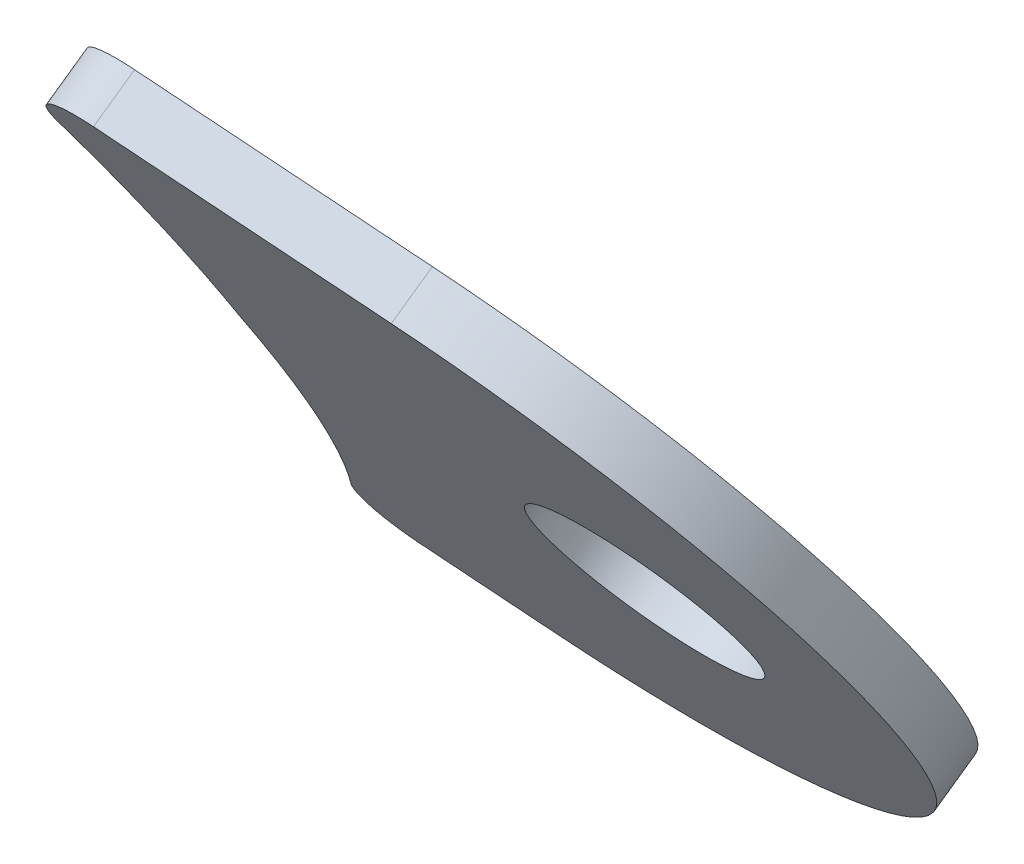
ISO-10303-21;
HEADER;
FILE_DESCRIPTION(('STEP AP214'),'2;1');
FILE_NAME('part.step','',(''),(''),'','','');
FILE_SCHEMA(('AUTOMOTIVE_DESIGN { 1 0 10303 214 1 1 1 1 }'));
ENDSEC;
DATA;
#1=APPLICATION_CONTEXT('core data for automotive mechanical design processes');
#2=APPLICATION_PROTOCOL_DEFINITION('international standard','automotive_design',2000,#1);
#3=PRODUCT_CONTEXT('',#1,'mechanical');
#4=PRODUCT('Part','Part','',(#3));
#5=PRODUCT_RELATED_PRODUCT_CATEGORY('part','',(#4));
#6=PRODUCT_DEFINITION_FORMATION('','',#4);
#7=PRODUCT_DEFINITION_CONTEXT('part definition',#1,'design');
#8=PRODUCT_DEFINITION('design','',#6,#7);
#9=PRODUCT_DEFINITION_SHAPE('','',#8);
#10=(LENGTH_UNIT() NAMED_UNIT(*) SI_UNIT(.MILLI.,.METRE.));
#11=(NAMED_UNIT(*) PLANE_ANGLE_UNIT() SI_UNIT($,.RADIAN.));
#12=(NAMED_UNIT(*) SI_UNIT($,.STERADIAN.) SOLID_ANGLE_UNIT());
#13=UNCERTAINTY_MEASURE_WITH_UNIT(LENGTH_MEASURE(1.E-05),#10,'distance_accuracy_value','');
#14=(GEOMETRIC_REPRESENTATION_CONTEXT(3) GLOBAL_UNCERTAINTY_ASSIGNED_CONTEXT((#13)) GLOBAL_UNIT_ASSIGNED_CONTEXT((#10,
#11,#12)) REPRESENTATION_CONTEXT('',''));
#15=CARTESIAN_POINT('',(0.,0.,0.));
#16=DIRECTION('',(0.,0.,1.));
#17=DIRECTION('',(1.,0.,0.));
#18=AXIS2_PLACEMENT_3D('',#15,#16,#17);
#19=CARTESIAN_POINT('',(371.040543840284,300.287470839087,-261.642448336467));
#20=DIRECTION('',(0.,0.57357643635105,-0.819152044288989));
#21=DIRECTION('',(0.,0.819152044288989,0.57357643635105));
#22=AXIS2_PLACEMENT_3D('',#19,#20,#21);
#23=PLANE('',#22);
#24=DIRECTION('',(-0.94219390202809,0.274471742735837,0.192187183289192));
#25=VECTOR('',#24,1.);
#26=CARTESIAN_POINT('',(366.785178603698,290.485610064858,-268.505785139065));
#27=LINE('',#26,#25);
#28=CARTESIAN_POINT('',(366.785178603698,290.485610064858,-268.505785139065));
#29=VERTEX_POINT('',#28);
#30=CARTESIAN_POINT('',(363.185469858074,291.534245946099,-267.771522390183));
#31=VERTEX_POINT('',#30);
#32=EDGE_CURVE('E149',#29,#31,#27,.T.);
#33=ORIENTED_EDGE('',*,*,#32,.T.);
#34=CARTESIAN_POINT('',(363.717390512647,292.759478542878,-266.913605289858));
#35=DIRECTION('',(0.,0.57357643635105,-0.819152044288989));
#36=DIRECTION('',(0.,0.819152044288989,0.57357643635105));
#37=AXIS2_PLACEMENT_3D('',#34,#35,#36);
#38=CIRCLE('',#37,1.5875);
#39=CARTESIAN_POINT('',(362.293575400517,293.334583238913,-266.510912646434));
#40=VERTEX_POINT('',#39);
#41=EDGE_CURVE('E208',#31,#40,#38,.T.);
#42=ORIENTED_EDGE('',*,*,#41,.T.);
#43=CARTESIAN_POINT('',(352.67946044919,303.158891685046,-259.631857814754));
#44=DIRECTION('',(0.,0.57357643635105,-0.819152044288989));
#45=DIRECTION('',(0.111787479362518,0.814017711231802,0.569981337640728));
#46=AXIS2_PLACEMENT_3D('',#43,#44,#45);
#47=ELLIPSE('',#46,21.0993504691637,12.7);
#48=CARTESIAN_POINT('',(365.299858584944,301.995940718526,-260.44616484808));
#49=VERTEX_POINT('',#48);
#50=EDGE_CURVE('E129',#40,#49,#47,.F.);
#51=ORIENTED_EDGE('',*,*,#50,.T.);
#52=CARTESIAN_POINT('',(365.401849986694,302.854607331279,-259.844920013018));
#53=VERTEX_POINT('',#52);
#54=EDGE_CURVE('E121',#49,#53,#47,.F.);
#55=ORIENTED_EDGE('',*,*,#54,.T.);
#56=CARTESIAN_POINT('',(352.91490042542,304.873326178752,-258.431397858495));
#57=DIRECTION('',(0.,-0.57357643635105,0.819152044288989));
#58=DIRECTION('',(0.111787479362519,0.814017711231802,0.569981337640728));
#59=AXIS2_PLACEMENT_3D('',#56,#57,#58);
#60=ELLIPSE('',#59,21.0993504691637,12.7);
#61=CARTESIAN_POINT('',(365.376596906032,310.940102346574,-254.183395453155));
#62=VERTEX_POINT('',#61);
#63=EDGE_CURVE('E107',#62,#53,#60,.F.);
#64=ORIENTED_EDGE('',*,*,#63,.F.);
#65=CARTESIAN_POINT('',(366.944866523468,311.141897683687,-254.042096836933));
#66=DIRECTION('',(0.,0.57357643635105,-0.819152044288989));
#67=DIRECTION('',(0.,0.819152044288989,0.57357643635105));
#68=AXIS2_PLACEMENT_3D('',#65,#66,#67);
#69=CIRCLE('',#68,1.5875);
#70=CARTESIAN_POINT('',(367.476787178041,312.367130280465,-253.184179736608));
#71=VERTEX_POINT('',#70);
#72=EDGE_CURVE('E206',#62,#71,#69,.T.);
#73=ORIENTED_EDGE('',*,*,#72,.T.);
#74=DIRECTION('',(0.942193902028088,-0.274471742735843,-0.192187183289195));
#75=VECTOR('',#74,1.);
#76=CARTESIAN_POINT('',(352.936883083732,316.60276883362,-250.218353692558));
#77=LINE('',#76,#75);
#78=CARTESIAN_POINT('',(375.295909076869,310.089331613316,-254.77911153387));
#79=VERTEX_POINT('',#78);
#80=EDGE_CURVE('E144',#71,#79,#77,.T.);
#81=ORIENTED_EDGE('',*,*,#80,.T.);
#82=CARTESIAN_POINT('',(371.040543840284,300.287470839087,-261.642448336467));
#83=DIRECTION('',(0.,0.57357643635105,-0.819152044288989));
#84=DIRECTION('',(0.,0.819152044288989,0.57357643635105));
#85=AXIS2_PLACEMENT_3D('',#82,#83,#84);
#86=CIRCLE('',#85,12.6999999999999);
#87=EDGE_CURVE('E146',#79,#29,#86,.T.);
#88=ORIENTED_EDGE('',*,*,#87,.T.);
#89=EDGE_LOOP('',(#33,#42,#51,#55,#64,#73,#81,#88));
#90=FACE_BOUND('',#89,.T.);
#91=CARTESIAN_POINT('',(375.527742298692,298.980299164308,-262.557739796882));
#92=DIRECTION('',(0.,0.57357643635105,-0.819152044288989));
#93=DIRECTION('',(0.,0.819152044288989,0.57357643635105));
#94=AXIS2_PLACEMENT_3D('',#91,#92,#93);
#95=CIRCLE('',#94,3.30199999999999);
#96=CARTESIAN_POINT('',(375.527742298692,301.68513921455,-260.663790404051));
#97=VERTEX_POINT('',#96);
#98=EDGE_CURVE('E137',#97,#97,#95,.T.);
#99=ORIENTED_EDGE('',*,*,#98,.F.);
#100=EDGE_LOOP('',(#99));
#101=FACE_BOUND('',#100,.T.);
#102=ADVANCED_FACE('F43',(#90,#101),#23,.T.);
#103=CARTESIAN_POINT('',(371.040543840284,299.37691824638,-260.342044466158));
#104=DIRECTION('',(0.,0.57357643635105,-0.819152044288989));
#105=DIRECTION('',(0.,0.819152044288989,0.57357643635105));
#106=AXIS2_PLACEMENT_3D('',#103,#104,#105);
#107=PLANE('',#106);
#108=CARTESIAN_POINT('',(352.67946044919,302.248339092339,-258.331453944445));
#109=DIRECTION('',(0.,0.57357643635105,-0.819152044288989));
#110=DIRECTION('',(0.111787479362519,0.814017711231802,0.569981337640728));
#111=AXIS2_PLACEMENT_3D('',#108,#109,#110);
#112=ELLIPSE('',#111,21.0993504691637,12.7);
#113=CARTESIAN_POINT('',(365.401849986694,301.944054738573,-258.544516142712));
#114=VERTEX_POINT('',#113);
#115=CARTESIAN_POINT('',(362.293575400517,292.424030646206,-265.210508776125));
#116=VERTEX_POINT('',#115);
#117=EDGE_CURVE('E114',#114,#116,#112,.T.);
#118=ORIENTED_EDGE('',*,*,#117,.T.);
#119=CARTESIAN_POINT('',(363.717390512647,291.84892595017,-265.613201419549));
#120=DIRECTION('',(0.,0.57357643635105,-0.819152044288989));
#121=DIRECTION('',(0.,0.819152044288989,0.57357643635105));
#122=AXIS2_PLACEMENT_3D('',#119,#120,#121);
#123=CIRCLE('',#122,1.5875);
#124=CARTESIAN_POINT('',(363.185469858074,290.623693353392,-266.471118519874));
#125=VERTEX_POINT('',#124);
#126=EDGE_CURVE('E214',#116,#125,#123,.F.);
#127=ORIENTED_EDGE('',*,*,#126,.T.);
#128=DIRECTION('',(-0.94219390202809,0.274471742735837,0.192187183289192));
#129=VECTOR('',#128,1.);
#130=CARTESIAN_POINT('',(366.785178603698,289.575057472151,-267.205381268756));
#131=LINE('',#130,#129);
#132=CARTESIAN_POINT('',(366.785178603698,289.575057472151,-267.205381268756));
#133=VERTEX_POINT('',#132);
#134=EDGE_CURVE('E147',#133,#125,#131,.T.);
#135=ORIENTED_EDGE('',*,*,#134,.F.);
#136=CARTESIAN_POINT('',(371.040543840284,299.37691824638,-260.342044466158));
#137=DIRECTION('',(0.,0.57357643635105,-0.819152044288989));
#138=DIRECTION('',(0.,0.819152044288989,0.57357643635105));
#139=AXIS2_PLACEMENT_3D('',#136,#137,#138);
#140=CIRCLE('',#139,12.6999999999999);
#141=CARTESIAN_POINT('',(375.295909076869,309.178779020609,-253.478707663561));
#142=VERTEX_POINT('',#141);
#143=EDGE_CURVE('E155',#142,#133,#140,.T.);
#144=ORIENTED_EDGE('',*,*,#143,.F.);
#145=DIRECTION('',(0.942193902028088,-0.274471742735843,-0.192187183289195));
#146=VECTOR('',#145,1.);
#147=CARTESIAN_POINT('',(352.936883083732,315.692216240912,-248.917949822249));
#148=LINE('',#147,#146);
#149=CARTESIAN_POINT('',(367.476787178041,311.456577687758,-251.883775866299));
#150=VERTEX_POINT('',#149);
#151=EDGE_CURVE('E139',#150,#142,#148,.T.);
#152=ORIENTED_EDGE('',*,*,#151,.F.);
#153=CARTESIAN_POINT('',(366.944866523468,310.231345090979,-252.741692966624));
#154=DIRECTION('',(0.,0.57357643635105,-0.819152044288989));
#155=DIRECTION('',(0.,0.819152044288989,0.57357643635105));
#156=AXIS2_PLACEMENT_3D('',#153,#154,#155);
#157=CIRCLE('',#156,1.5875);
#158=CARTESIAN_POINT('',(365.376596906032,310.029549753867,-252.882991582846));
#159=VERTEX_POINT('',#158);
#160=EDGE_CURVE('E58',#150,#159,#157,.F.);
#161=ORIENTED_EDGE('',*,*,#160,.T.);
#162=CARTESIAN_POINT('',(352.91490042542,303.962773586045,-257.130993988186));
#163=DIRECTION('',(0.,-0.57357643635105,0.819152044288989));
#164=DIRECTION('',(0.111787479362519,0.814017711231802,0.569981337640728));
#165=AXIS2_PLACEMENT_3D('',#162,#163,#164);
#166=ELLIPSE('',#165,21.0993504691637,12.7);
#167=CARTESIAN_POINT('',(365.535298561174,302.799822619524,-257.945301021512));
#168=VERTEX_POINT('',#167);
#169=EDGE_CURVE('E124',#168,#159,#166,.T.);
#170=ORIENTED_EDGE('',*,*,#169,.F.);
#171=CARTESIAN_POINT('',(352.91490042542,303.962773586045,-257.130993988186));
#172=DIRECTION('',(0.,0.57357643635105,-0.819152044288989));
#173=DIRECTION('',(0.111787479362518,0.814017711231802,0.569981337640728));
#174=AXIS2_PLACEMENT_3D('',#171,#172,#173);
#175=ELLIPSE('',#174,21.0993504691637,12.7);
#176=EDGE_CURVE('E123',#114,#168,#175,.F.);
#177=ORIENTED_EDGE('',*,*,#176,.F.);
#178=EDGE_LOOP('',(#118,#127,#135,#144,#152,#161,#170,#177));
#179=FACE_BOUND('',#178,.T.);
#180=CARTESIAN_POINT('',(375.527742298692,298.0697465716,-261.257335926573));
#181=DIRECTION('',(0.,0.57357643635105,-0.819152044288989));
#182=DIRECTION('',(0.,0.819152044288989,0.57357643635105));
#183=AXIS2_PLACEMENT_3D('',#180,#181,#182);
#184=CIRCLE('',#183,3.30199999999999);
#185=CARTESIAN_POINT('',(375.527742298692,300.774586621843,-259.363386533742));
#186=VERTEX_POINT('',#185);
#187=EDGE_CURVE('E132',#186,#186,#184,.T.);
#188=ORIENTED_EDGE('',*,*,#187,.T.);
#189=EDGE_LOOP('',(#188));
#190=FACE_BOUND('',#189,.T.);
#191=ADVANCED_FACE('F221',(#179,#190),#107,.F.);
#192=CARTESIAN_POINT('',(352.936883083732,316.60276883362,-250.218353692558));
#193=DIRECTION('',(-0.33506812886499,-0.771800060962928,-0.540420220676961));
#194=DIRECTION('',(0.,0.57357643635105,-0.819152044288989));
#195=AXIS2_PLACEMENT_3D('',#192,#193,#194);
#196=PLANE('',#195);
#197=ORIENTED_EDGE('',*,*,#80,.F.);
#198=DIRECTION('',(0.,-0.57357643635105,0.819152044288989));
#199=VECTOR('',#198,1.);
#200=CARTESIAN_POINT('',(367.476787178041,312.367130280465,-253.184179736608));
#201=LINE('',#200,#199);
#202=EDGE_CURVE('E51',#71,#150,#201,.T.);
#203=ORIENTED_EDGE('',*,*,#202,.T.);
#204=ORIENTED_EDGE('',*,*,#151,.T.);
#205=DIRECTION('',(0.,-0.57357643635105,0.819152044288989));
#206=VECTOR('',#205,1.);
#207=CARTESIAN_POINT('',(375.295909076869,310.089331613316,-254.77911153387));
#208=LINE('',#207,#206);
#209=EDGE_CURVE('E195',#79,#142,#208,.T.);
#210=ORIENTED_EDGE('',*,*,#209,.F.);
#211=EDGE_LOOP('',(#197,#203,#204,#210));
#212=FACE_BOUND('',#211,.T.);
#213=ADVANCED_FACE('F218',(#212),#196,.F.);
#214=CARTESIAN_POINT('',(371.040543840284,300.287470839087,-261.642448336467));
#215=DIRECTION('',(0.,-0.57357643635105,0.819152044288989));
#216=DIRECTION('',(0.,-0.819152044288989,-0.57357643635105));
#217=AXIS2_PLACEMENT_3D('',#214,#215,#216);
#218=CYLINDRICAL_SURFACE('',#217,12.6999999999999);
#219=ORIENTED_EDGE('',*,*,#143,.T.);
#220=DIRECTION('',(0.,-0.57357643635105,0.819152044288989));
#221=VECTOR('',#220,1.);
#222=CARTESIAN_POINT('',(366.785178603698,290.485610064858,-268.505785139065));
#223=LINE('',#222,#221);
#224=EDGE_CURVE('E151',#29,#133,#223,.T.);
#225=ORIENTED_EDGE('',*,*,#224,.F.);
#226=ORIENTED_EDGE('',*,*,#87,.F.);
#227=ORIENTED_EDGE('',*,*,#209,.T.);
#228=EDGE_LOOP('',(#219,#225,#226,#227));
#229=FACE_BOUND('',#228,.T.);
#230=ADVANCED_FACE('F227',(#229),#218,.T.);
#231=CARTESIAN_POINT('',(366.785178603698,290.485610064858,-268.505785139065));
#232=DIRECTION('',(0.335068128864983,0.77180006096293,0.540420220676962));
#233=DIRECTION('',(0.,-0.57357643635105,0.819152044288989));
#234=AXIS2_PLACEMENT_3D('',#231,#232,#233);
#235=PLANE('',#234);
#236=ORIENTED_EDGE('',*,*,#134,.T.);
#237=DIRECTION('',(0.,0.57357643635105,-0.819152044288989));
#238=VECTOR('',#237,1.);
#239=CARTESIAN_POINT('',(363.185469858074,291.534245946099,-267.771522390183));
#240=LINE('',#239,#238);
#241=EDGE_CURVE('E203',#125,#31,#240,.T.);
#242=ORIENTED_EDGE('',*,*,#241,.T.);
#243=ORIENTED_EDGE('',*,*,#32,.F.);
#244=ORIENTED_EDGE('',*,*,#224,.T.);
#245=EDGE_LOOP('',(#236,#242,#243,#244));
#246=FACE_BOUND('',#245,.T.);
#247=ADVANCED_FACE('F231',(#246),#235,.F.);
#248=CARTESIAN_POINT('',(375.527742298692,298.980299164308,-262.557739796882));
#249=DIRECTION('',(0.,-0.57357643635105,0.819152044288989));
#250=DIRECTION('',(0.,-0.819152044288989,-0.57357643635105));
#251=AXIS2_PLACEMENT_3D('',#248,#249,#250);
#252=CYLINDRICAL_SURFACE('',#251,3.30199999999999);
#253=ORIENTED_EDGE('',*,*,#98,.T.);
#254=EDGE_LOOP('',(#253));
#255=FACE_BOUND('',#254,.T.);
#256=ORIENTED_EDGE('',*,*,#187,.F.);
#257=EDGE_LOOP('',(#256));
#258=FACE_BOUND('',#257,.T.);
#259=ADVANCED_FACE('F245',(#255,#258),#252,.F.);
#260=CARTESIAN_POINT('',(351.508749434956,299.161637647264,-272.067251640988));
#261=DIRECTION('',(0.0892690897094424,0.304798729107071,0.948224005368543));
#262=DIRECTION('',(0.,-0.952024922064358,0.306020502202634));
#263=AXIS2_PLACEMENT_3D('',#260,#261,#262);
#264=CYLINDRICAL_SURFACE('',#263,12.7);
#265=CARTESIAN_POINT('',(365.401849986694,302.854607331279,-259.844920013019));
#266=CARTESIAN_POINT('',(365.450416079322,302.836299901285,-259.226816352867));
#267=CARTESIAN_POINT('',(365.493982005512,302.818452738556,-258.608368147847));
#268=CARTESIAN_POINT('',(365.533467541334,302.800651173437,-257.974817468455));
#269=CARTESIAN_POINT('',(365.534384473304,302.80023676558,-257.960059342972));
#270=CARTESIAN_POINT('',(365.535298561174,302.799822619524,-257.945301021512));
#271=B_SPLINE_CURVE_WITH_KNOTS('',3,(#265,#266,#267,#268,#269,#270),.UNSPECIFIED.,.F.,.F.,(4,2,
4),(0.,1.86071283139162,1.90508999773747),.UNSPECIFIED.);
#272=EDGE_CURVE('E110',#53,#168,#271,.T.);
#273=ORIENTED_EDGE('',*,*,#272,.F.);
#274=ORIENTED_EDGE('',*,*,#54,.F.);
#275=CARTESIAN_POINT('',(365.373403736494,301.7091455477,-247.874570456561));
#276=CARTESIAN_POINT('',(365.399270409949,301.717572909003,-248.361786665088));
#277=CARTESIAN_POINT('',(365.421546069605,301.726340246321,-248.849178552635));
#278=CARTESIAN_POINT('',(365.459127563791,301.744532749654,-249.824211912226));
#279=CARTESIAN_POINT('',(365.474433502552,301.753957905828,-250.311853380428));
#280=CARTESIAN_POINT('',(365.510217125372,301.783188210244,-251.775066310051));
#281=CARTESIAN_POINT('',(365.520558271702,301.803947413815,-252.750881386155));
#282=CARTESIAN_POINT('',(365.515058376435,301.850977901035,-254.840025736226));
#283=CARTESIAN_POINT('',(365.495317861988,301.877613648368,-255.953333956771));
#284=CARTESIAN_POINT('',(365.423275414373,301.933905847927,-258.178757456953));
#285=CARTESIAN_POINT('',(365.370976150208,301.963562052384,-259.29087282689));
#286=CARTESIAN_POINT('',(365.301683914037,301.99511268966,-260.416648057619));
#287=CARTESIAN_POINT('',(365.300772668429,301.995526573474,-260.431406550443));
#288=CARTESIAN_POINT('',(365.299858584944,301.995940718526,-260.44616484808));
#289=B_SPLINE_CURVE_WITH_KNOTS('',3,(#275,#276,#277,#278,#279,#280,#281,#282,#283,#284,#285,
#286,#287,#288),.UNSPECIFIED.,.F.,.F.,(4,2,2,2,2,2,4),(0.,1.46389575943695,2.92776962541478,
5.85565224319214,9.19658686538578,12.5372476503844,12.5816248167304),.UNSPECIFIED.);
#290=EDGE_CURVE('E197',#114,#49,#289,.T.);
#291=ORIENTED_EDGE('',*,*,#290,.F.);
#292=ORIENTED_EDGE('',*,*,#176,.T.);
#293=EDGE_LOOP('',(#273,#274,#291,#292));
#294=FACE_BOUND('',#293,.T.);
#295=ADVANCED_FACE('F119',(#294),#264,.F.);
#296=CARTESIAN_POINT('',(352.67946044919,294.597037822302,-247.404263286659));
#297=DIRECTION('',(0.,0.57357643635105,-0.819152044288989));
#298=DIRECTION('',(0.111787479362519,0.814017711231802,0.569981337640728));
#299=AXIS2_PLACEMENT_3D('',#296,#297,#298);
#300=ELLIPSE('',#299,21.0993504691637,12.7);
#301=DIRECTION('',(0.,0.57357643635105,-0.819152044288989));
#302=VECTOR('',#301,1.);
#303=SURFACE_OF_LINEAR_EXTRUSION('',#300,#302);
#304=ORIENTED_EDGE('',*,*,#50,.F.);
#305=DIRECTION('',(0.,0.57357643635105,-0.819152044288989));
#306=VECTOR('',#305,1.);
#307=CARTESIAN_POINT('',(362.293575400517,293.334583238913,-266.510912646434));
#308=LINE('',#307,#306);
#309=EDGE_CURVE('E210',#40,#116,#308,.F.);
#310=ORIENTED_EDGE('',*,*,#309,.T.);
#311=ORIENTED_EDGE('',*,*,#117,.F.);
#312=ORIENTED_EDGE('',*,*,#290,.T.);
#313=EDGE_LOOP('',(#304,#310,#311,#312));
#314=FACE_BOUND('',#313,.T.);
#315=ADVANCED_FACE('F179',(#314),#303,.F.);
#316=CARTESIAN_POINT('',(352.91490042542,312.621946223254,-269.497574130052));
#317=DIRECTION('',(0.,-0.57357643635105,0.819152044288989));
#318=DIRECTION('',(0.111787479362519,0.814017711231802,0.569981337640728));
#319=AXIS2_PLACEMENT_3D('',#316,#317,#318);
#320=ELLIPSE('',#319,21.0993504691637,12.7);
#321=DIRECTION('',(0.,-0.57357643635105,0.819152044288989));
#322=VECTOR('',#321,1.);
#323=SURFACE_OF_LINEAR_EXTRUSION('',#320,#322);
#324=ORIENTED_EDGE('',*,*,#169,.T.);
#325=DIRECTION('',(0.,-0.57357643635105,0.819152044288989));
#326=VECTOR('',#325,1.);
#327=CARTESIAN_POINT('',(365.376596906032,310.029549753867,-252.882991582846));
#328=LINE('',#327,#326);
#329=EDGE_CURVE('E12',#159,#62,#328,.F.);
#330=ORIENTED_EDGE('',*,*,#329,.T.);
#331=ORIENTED_EDGE('',*,*,#63,.T.);
#332=ORIENTED_EDGE('',*,*,#272,.T.);
#333=EDGE_LOOP('',(#324,#330,#331,#332));
#334=FACE_BOUND('',#333,.T.);
#335=ADVANCED_FACE('F109',(#334),#323,.F.);
#336=CARTESIAN_POINT('',(363.717390512647,292.304202246524,-266.263403354703));
#337=DIRECTION('',(0.,0.57357643635105,-0.819152044288989));
#338=DIRECTION('',(0.,0.819152044288989,0.57357643635105));
#339=AXIS2_PLACEMENT_3D('',#336,#337,#338);
#340=CYLINDRICAL_SURFACE('',#339,1.5875);
#341=ORIENTED_EDGE('',*,*,#126,.F.);
#342=ORIENTED_EDGE('',*,*,#309,.F.);
#343=ORIENTED_EDGE('',*,*,#41,.F.);
#344=ORIENTED_EDGE('',*,*,#241,.F.);
#345=EDGE_LOOP('',(#341,#342,#343,#344));
#346=FACE_BOUND('',#345,.T.);
#347=ADVANCED_FACE('F178',(#346),#340,.T.);
#348=CARTESIAN_POINT('',(366.944866523468,310.686621387333,-253.391894901778));
#349=DIRECTION('',(0.,-0.57357643635105,0.819152044288989));
#350=DIRECTION('',(0.,-0.819152044288989,-0.57357643635105));
#351=AXIS2_PLACEMENT_3D('',#348,#349,#350);
#352=CYLINDRICAL_SURFACE('',#351,1.5875);
#353=ORIENTED_EDGE('',*,*,#72,.F.);
#354=ORIENTED_EDGE('',*,*,#329,.F.);
#355=ORIENTED_EDGE('',*,*,#160,.F.);
#356=ORIENTED_EDGE('',*,*,#202,.F.);
#357=EDGE_LOOP('',(#353,#354,#355,#356));
#358=FACE_BOUND('',#357,.T.);
#359=ADVANCED_FACE('F45',(#358),#352,.T.);
#360=CLOSED_SHELL('',(#102,#191,#213,#230,#247,#259,#295,#315,#335,#347,#359));
#361=MANIFOLD_SOLID_BREP('B2',#360);
#362=ADVANCED_BREP_SHAPE_REPRESENTATION('',(#18,#361),#14);
#363=SHAPE_DEFINITION_REPRESENTATION(#9,#362);
ENDSEC;
END-ISO-10303-21;
